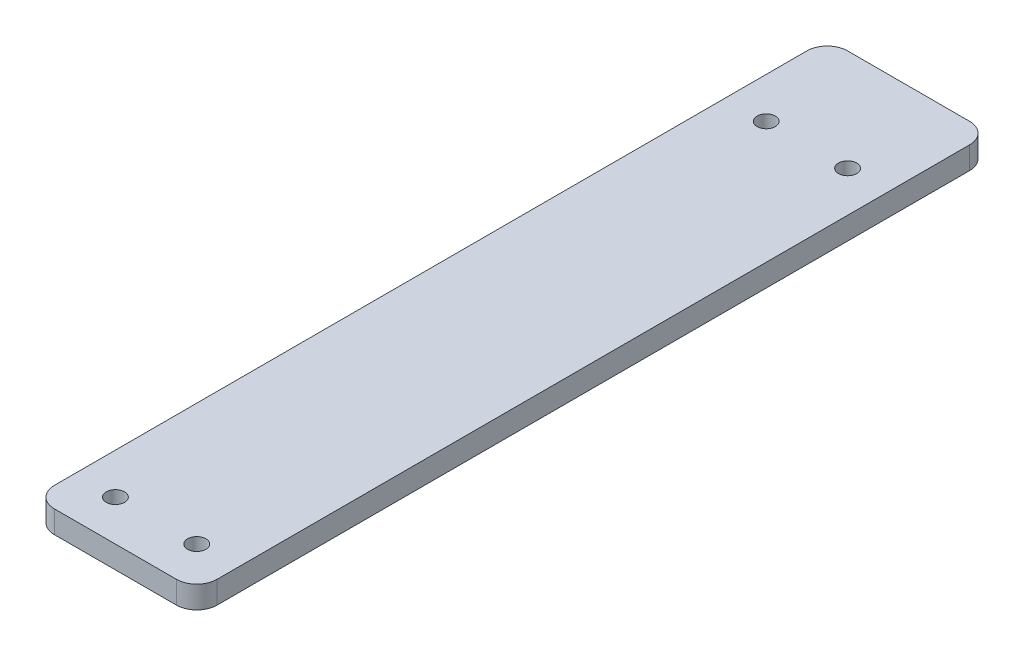
ISO-10303-21;
HEADER;
FILE_DESCRIPTION(('STEP AP214'),'2;1');
FILE_NAME('part.step','',(''),(''),'','','');
FILE_SCHEMA(('AUTOMOTIVE_DESIGN { 1 0 10303 214 1 1 1 1 }'));
ENDSEC;
DATA;
#1=APPLICATION_CONTEXT('core data for automotive mechanical design processes');
#2=APPLICATION_PROTOCOL_DEFINITION('international standard','automotive_design',2000,#1);
#3=PRODUCT_CONTEXT('',#1,'mechanical');
#4=PRODUCT('Part','Part','',(#3));
#5=PRODUCT_RELATED_PRODUCT_CATEGORY('part','',(#4));
#6=PRODUCT_DEFINITION_FORMATION('','',#4);
#7=PRODUCT_DEFINITION_CONTEXT('part definition',#1,'design');
#8=PRODUCT_DEFINITION('design','',#6,#7);
#9=PRODUCT_DEFINITION_SHAPE('','',#8);
#10=(LENGTH_UNIT() NAMED_UNIT(*) SI_UNIT(.MILLI.,.METRE.));
#11=(NAMED_UNIT(*) PLANE_ANGLE_UNIT() SI_UNIT($,.RADIAN.));
#12=(NAMED_UNIT(*) SI_UNIT($,.STERADIAN.) SOLID_ANGLE_UNIT());
#13=UNCERTAINTY_MEASURE_WITH_UNIT(LENGTH_MEASURE(1.E-05),#10,'distance_accuracy_value','');
#14=(GEOMETRIC_REPRESENTATION_CONTEXT(3) GLOBAL_UNCERTAINTY_ASSIGNED_CONTEXT((#13)) GLOBAL_UNIT_ASSIGNED_CONTEXT((#10,
#11,#12)) REPRESENTATION_CONTEXT('',''));
#15=CARTESIAN_POINT('',(0.,0.,0.));
#16=DIRECTION('',(0.,0.,1.));
#17=DIRECTION('',(1.,0.,0.));
#18=AXIS2_PLACEMENT_3D('',#15,#16,#17);
#19=CARTESIAN_POINT('',(-35.,5.5,5.));
#20=DIRECTION('',(0.,1.,0.));
#21=DIRECTION('',(0.,0.,1.));
#22=AXIS2_PLACEMENT_3D('',#19,#20,#21);
#23=PLANE('',#22);
#24=CARTESIAN_POINT('',(-30.,5.5,185.));
#25=DIRECTION('',(0.,1.,0.));
#26=DIRECTION('',(0.,0.,1.));
#27=AXIS2_PLACEMENT_3D('',#24,#25,#26);
#28=CIRCLE('',#27,2.25);
#29=CARTESIAN_POINT('',(-30.,5.5,187.25));
#30=VERTEX_POINT('',#29);
#31=EDGE_CURVE('E188',#30,#30,#28,.T.);
#32=ORIENTED_EDGE('',*,*,#31,.F.);
#33=EDGE_LOOP('',(#32));
#34=FACE_BOUND('',#33,.T.);
#35=CARTESIAN_POINT('',(-30.,5.5,25.));
#36=DIRECTION('',(0.,1.,0.));
#37=DIRECTION('',(0.,0.,1.));
#38=AXIS2_PLACEMENT_3D('',#35,#36,#37);
#39=CIRCLE('',#38,2.25);
#40=CARTESIAN_POINT('',(-30.,5.5,27.25));
#41=VERTEX_POINT('',#40);
#42=EDGE_CURVE('E134',#41,#41,#39,.T.);
#43=ORIENTED_EDGE('',*,*,#42,.F.);
#44=EDGE_LOOP('',(#43));
#45=FACE_BOUND('',#44,.T.);
#46=CARTESIAN_POINT('',(-35.,5.5,5.));
#47=DIRECTION('',(0.,1.,0.));
#48=DIRECTION('',(0.,0.,1.));
#49=AXIS2_PLACEMENT_3D('',#46,#47,#48);
#50=CIRCLE('',#49,5.);
#51=CARTESIAN_POINT('',(-35.,5.5,0.));
#52=VERTEX_POINT('',#51);
#53=CARTESIAN_POINT('',(-40.,5.5,5.));
#54=VERTEX_POINT('',#53);
#55=EDGE_CURVE('E145',#52,#54,#50,.T.);
#56=ORIENTED_EDGE('',*,*,#55,.T.);
#57=DIRECTION('',(0.,0.,1.));
#58=VECTOR('',#57,1.);
#59=CARTESIAN_POINT('',(-40.,5.5,190.));
#60=LINE('',#59,#58);
#61=CARTESIAN_POINT('',(-40.,5.5,190.));
#62=VERTEX_POINT('',#61);
#63=EDGE_CURVE('E93',#54,#62,#60,.T.);
#64=ORIENTED_EDGE('',*,*,#63,.T.);
#65=CARTESIAN_POINT('',(-35.,5.5,190.));
#66=DIRECTION('',(0.,1.,0.));
#67=DIRECTION('',(0.,0.,1.));
#68=AXIS2_PLACEMENT_3D('',#65,#66,#67);
#69=CIRCLE('',#68,5.);
#70=CARTESIAN_POINT('',(-35.,5.5,195.));
#71=VERTEX_POINT('',#70);
#72=EDGE_CURVE('E160',#62,#71,#69,.T.);
#73=ORIENTED_EDGE('',*,*,#72,.T.);
#74=DIRECTION('',(1.,0.,0.));
#75=VECTOR('',#74,1.);
#76=CARTESIAN_POINT('',(-4.99999999999996,5.5,195.));
#77=LINE('',#76,#75);
#78=CARTESIAN_POINT('',(-4.99999999999996,5.5,195.));
#79=VERTEX_POINT('',#78);
#80=EDGE_CURVE('E173',#71,#79,#77,.T.);
#81=ORIENTED_EDGE('',*,*,#80,.T.);
#82=CARTESIAN_POINT('',(-4.99999999999996,5.5,190.));
#83=DIRECTION('',(0.,1.,0.));
#84=DIRECTION('',(0.,0.,1.));
#85=AXIS2_PLACEMENT_3D('',#82,#83,#84);
#86=CIRCLE('',#85,4.99999999999999);
#87=CARTESIAN_POINT('',(0.,5.5,190.));
#88=VERTEX_POINT('',#87);
#89=EDGE_CURVE('E112',#79,#88,#86,.T.);
#90=ORIENTED_EDGE('',*,*,#89,.T.);
#91=DIRECTION('',(0.,0.,-1.));
#92=VECTOR('',#91,1.);
#93=CARTESIAN_POINT('',(0.,5.5,5.));
#94=LINE('',#93,#92);
#95=CARTESIAN_POINT('',(0.,5.5,5.));
#96=VERTEX_POINT('',#95);
#97=EDGE_CURVE('E106',#88,#96,#94,.T.);
#98=ORIENTED_EDGE('',*,*,#97,.T.);
#99=CARTESIAN_POINT('',(-4.99999999999998,5.5,5.));
#100=DIRECTION('',(0.,1.,0.));
#101=DIRECTION('',(0.,0.,1.));
#102=AXIS2_PLACEMENT_3D('',#99,#100,#101);
#103=CIRCLE('',#102,4.99999999999999);
#104=CARTESIAN_POINT('',(-4.99999999999998,5.5,0.));
#105=VERTEX_POINT('',#104);
#106=EDGE_CURVE('E110',#96,#105,#103,.T.);
#107=ORIENTED_EDGE('',*,*,#106,.T.);
#108=DIRECTION('',(-1.,0.,0.));
#109=VECTOR('',#108,1.);
#110=CARTESIAN_POINT('',(-35.,5.5,0.));
#111=LINE('',#110,#109);
#112=EDGE_CURVE('E50',#105,#52,#111,.T.);
#113=ORIENTED_EDGE('',*,*,#112,.T.);
#114=EDGE_LOOP('',(#56,#64,#73,#81,#90,#98,#107,#113));
#115=FACE_BOUND('',#114,.T.);
#116=CARTESIAN_POINT('',(-9.99999999999998,5.5,25.));
#117=DIRECTION('',(0.,1.,0.));
#118=DIRECTION('',(0.,0.,1.));
#119=AXIS2_PLACEMENT_3D('',#116,#117,#118);
#120=CIRCLE('',#119,2.25);
#121=CARTESIAN_POINT('',(-9.99999999999998,5.5,27.25));
#122=VERTEX_POINT('',#121);
#123=EDGE_CURVE('E182',#122,#122,#120,.T.);
#124=ORIENTED_EDGE('',*,*,#123,.F.);
#125=EDGE_LOOP('',(#124));
#126=FACE_BOUND('',#125,.T.);
#127=CARTESIAN_POINT('',(-9.99999999999998,5.5,185.));
#128=DIRECTION('',(0.,1.,0.));
#129=DIRECTION('',(0.,0.,1.));
#130=AXIS2_PLACEMENT_3D('',#127,#128,#129);
#131=CIRCLE('',#130,2.25);
#132=CARTESIAN_POINT('',(-9.99999999999998,5.5,187.25));
#133=VERTEX_POINT('',#132);
#134=EDGE_CURVE('E194',#133,#133,#131,.T.);
#135=ORIENTED_EDGE('',*,*,#134,.F.);
#136=EDGE_LOOP('',(#135));
#137=FACE_BOUND('',#136,.T.);
#138=ADVANCED_FACE('F33',(#34,#45,#115,#126,#137),#23,.T.);
#139=CARTESIAN_POINT('',(-35.,0.,5.));
#140=DIRECTION('',(0.,1.,0.));
#141=DIRECTION('',(0.,0.,1.));
#142=AXIS2_PLACEMENT_3D('',#139,#140,#141);
#143=PLANE('',#142);
#144=CARTESIAN_POINT('',(-35.,0.,5.));
#145=DIRECTION('',(0.,1.,0.));
#146=DIRECTION('',(0.,0.,1.));
#147=AXIS2_PLACEMENT_3D('',#144,#145,#146);
#148=CIRCLE('',#147,5.);
#149=CARTESIAN_POINT('',(-35.,0.,0.));
#150=VERTEX_POINT('',#149);
#151=CARTESIAN_POINT('',(-40.,0.,5.));
#152=VERTEX_POINT('',#151);
#153=EDGE_CURVE('E130',#150,#152,#148,.T.);
#154=ORIENTED_EDGE('',*,*,#153,.F.);
#155=DIRECTION('',(-1.,0.,0.));
#156=VECTOR('',#155,1.);
#157=CARTESIAN_POINT('',(-35.,0.,0.));
#158=LINE('',#157,#156);
#159=CARTESIAN_POINT('',(-4.99999999999998,0.,0.));
#160=VERTEX_POINT('',#159);
#161=EDGE_CURVE('E85',#160,#150,#158,.T.);
#162=ORIENTED_EDGE('',*,*,#161,.F.);
#163=CARTESIAN_POINT('',(-4.99999999999998,0.,5.));
#164=DIRECTION('',(0.,1.,0.));
#165=DIRECTION('',(0.,0.,1.));
#166=AXIS2_PLACEMENT_3D('',#163,#164,#165);
#167=CIRCLE('',#166,4.99999999999999);
#168=CARTESIAN_POINT('',(0.,0.,5.));
#169=VERTEX_POINT('',#168);
#170=EDGE_CURVE('E79',#169,#160,#167,.T.);
#171=ORIENTED_EDGE('',*,*,#170,.F.);
#172=DIRECTION('',(0.,0.,-1.));
#173=VECTOR('',#172,1.);
#174=CARTESIAN_POINT('',(0.,0.,5.));
#175=LINE('',#174,#173);
#176=CARTESIAN_POINT('',(0.,0.,190.));
#177=VERTEX_POINT('',#176);
#178=EDGE_CURVE('E120',#177,#169,#175,.T.);
#179=ORIENTED_EDGE('',*,*,#178,.F.);
#180=CARTESIAN_POINT('',(-4.99999999999996,0.,190.));
#181=DIRECTION('',(0.,1.,0.));
#182=DIRECTION('',(0.,0.,1.));
#183=AXIS2_PLACEMENT_3D('',#180,#181,#182);
#184=CIRCLE('',#183,4.99999999999999);
#185=CARTESIAN_POINT('',(-4.99999999999996,0.,195.));
#186=VERTEX_POINT('',#185);
#187=EDGE_CURVE('E140',#186,#177,#184,.T.);
#188=ORIENTED_EDGE('',*,*,#187,.F.);
#189=DIRECTION('',(1.,0.,0.));
#190=VECTOR('',#189,1.);
#191=CARTESIAN_POINT('',(-4.99999999999996,0.,195.));
#192=LINE('',#191,#190);
#193=CARTESIAN_POINT('',(-35.,0.,195.));
#194=VERTEX_POINT('',#193);
#195=EDGE_CURVE('E138',#194,#186,#192,.T.);
#196=ORIENTED_EDGE('',*,*,#195,.F.);
#197=CARTESIAN_POINT('',(-35.,0.,190.));
#198=DIRECTION('',(0.,1.,0.));
#199=DIRECTION('',(0.,0.,1.));
#200=AXIS2_PLACEMENT_3D('',#197,#198,#199);
#201=CIRCLE('',#200,5.);
#202=CARTESIAN_POINT('',(-40.,0.,190.));
#203=VERTEX_POINT('',#202);
#204=EDGE_CURVE('E136',#203,#194,#201,.T.);
#205=ORIENTED_EDGE('',*,*,#204,.F.);
#206=DIRECTION('',(0.,0.,1.));
#207=VECTOR('',#206,1.);
#208=CARTESIAN_POINT('',(-40.,0.,190.));
#209=LINE('',#208,#207);
#210=EDGE_CURVE('E133',#152,#203,#209,.T.);
#211=ORIENTED_EDGE('',*,*,#210,.F.);
#212=EDGE_LOOP('',(#154,#162,#171,#179,#188,#196,#205,#211));
#213=FACE_BOUND('',#212,.T.);
#214=CARTESIAN_POINT('',(-30.,0.,25.));
#215=DIRECTION('',(0.,1.,0.));
#216=DIRECTION('',(0.,0.,1.));
#217=AXIS2_PLACEMENT_3D('',#214,#215,#216);
#218=CIRCLE('',#217,2.25);
#219=CARTESIAN_POINT('',(-30.,0.,27.25));
#220=VERTEX_POINT('',#219);
#221=EDGE_CURVE('E179',#220,#220,#218,.T.);
#222=ORIENTED_EDGE('',*,*,#221,.T.);
#223=EDGE_LOOP('',(#222));
#224=FACE_BOUND('',#223,.T.);
#225=CARTESIAN_POINT('',(-9.99999999999998,0.,25.));
#226=DIRECTION('',(0.,1.,0.));
#227=DIRECTION('',(0.,0.,1.));
#228=AXIS2_PLACEMENT_3D('',#225,#226,#227);
#229=CIRCLE('',#228,2.25);
#230=CARTESIAN_POINT('',(-9.99999999999998,0.,27.25));
#231=VERTEX_POINT('',#230);
#232=EDGE_CURVE('E185',#231,#231,#229,.T.);
#233=ORIENTED_EDGE('',*,*,#232,.T.);
#234=EDGE_LOOP('',(#233));
#235=FACE_BOUND('',#234,.T.);
#236=CARTESIAN_POINT('',(-30.,0.,185.));
#237=DIRECTION('',(0.,1.,0.));
#238=DIRECTION('',(0.,0.,1.));
#239=AXIS2_PLACEMENT_3D('',#236,#237,#238);
#240=CIRCLE('',#239,2.25);
#241=CARTESIAN_POINT('',(-30.,0.,187.25));
#242=VERTEX_POINT('',#241);
#243=EDGE_CURVE('E191',#242,#242,#240,.T.);
#244=ORIENTED_EDGE('',*,*,#243,.T.);
#245=EDGE_LOOP('',(#244));
#246=FACE_BOUND('',#245,.T.);
#247=CARTESIAN_POINT('',(-9.99999999999998,0.,185.));
#248=DIRECTION('',(0.,1.,0.));
#249=DIRECTION('',(0.,0.,1.));
#250=AXIS2_PLACEMENT_3D('',#247,#248,#249);
#251=CIRCLE('',#250,2.25);
#252=CARTESIAN_POINT('',(-9.99999999999998,0.,187.25));
#253=VERTEX_POINT('',#252);
#254=EDGE_CURVE('E197',#253,#253,#251,.T.);
#255=ORIENTED_EDGE('',*,*,#254,.T.);
#256=EDGE_LOOP('',(#255));
#257=FACE_BOUND('',#256,.T.);
#258=ADVANCED_FACE('F164',(#213,#224,#235,#246,#257),#143,.F.);
#259=CARTESIAN_POINT('',(-35.,5.5,5.));
#260=DIRECTION('',(0.,-1.,0.));
#261=DIRECTION('',(0.,0.,-1.));
#262=AXIS2_PLACEMENT_3D('',#259,#260,#261);
#263=CYLINDRICAL_SURFACE('',#262,5.);
#264=ORIENTED_EDGE('',*,*,#153,.T.);
#265=DIRECTION('',(0.,-1.,0.));
#266=VECTOR('',#265,1.);
#267=CARTESIAN_POINT('',(-40.,5.5,5.));
#268=LINE('',#267,#266);
#269=EDGE_CURVE('E11',#54,#152,#268,.T.);
#270=ORIENTED_EDGE('',*,*,#269,.F.);
#271=ORIENTED_EDGE('',*,*,#55,.F.);
#272=DIRECTION('',(0.,-1.,0.));
#273=VECTOR('',#272,1.);
#274=CARTESIAN_POINT('',(-35.,5.5,0.));
#275=LINE('',#274,#273);
#276=EDGE_CURVE('E126',#52,#150,#275,.T.);
#277=ORIENTED_EDGE('',*,*,#276,.T.);
#278=EDGE_LOOP('',(#264,#270,#271,#277));
#279=FACE_BOUND('',#278,.T.);
#280=ADVANCED_FACE('F35',(#279),#263,.T.);
#281=CARTESIAN_POINT('',(-40.,5.5,190.));
#282=DIRECTION('',(1.,0.,0.));
#283=DIRECTION('',(0.,0.,-1.));
#284=AXIS2_PLACEMENT_3D('',#281,#282,#283);
#285=PLANE('',#284);
#286=ORIENTED_EDGE('',*,*,#210,.T.);
#287=DIRECTION('',(0.,-1.,0.));
#288=VECTOR('',#287,1.);
#289=CARTESIAN_POINT('',(-40.,5.5,190.));
#290=LINE('',#289,#288);
#291=EDGE_CURVE('E42',#62,#203,#290,.T.);
#292=ORIENTED_EDGE('',*,*,#291,.F.);
#293=ORIENTED_EDGE('',*,*,#63,.F.);
#294=ORIENTED_EDGE('',*,*,#269,.T.);
#295=EDGE_LOOP('',(#286,#292,#293,#294));
#296=FACE_BOUND('',#295,.T.);
#297=ADVANCED_FACE('F231',(#296),#285,.F.);
#298=CARTESIAN_POINT('',(-35.,5.5,190.));
#299=DIRECTION('',(0.,-1.,0.));
#300=DIRECTION('',(0.,0.,-1.));
#301=AXIS2_PLACEMENT_3D('',#298,#299,#300);
#302=CYLINDRICAL_SURFACE('',#301,5.);
#303=ORIENTED_EDGE('',*,*,#204,.T.);
#304=DIRECTION('',(0.,-1.,0.));
#305=VECTOR('',#304,1.);
#306=CARTESIAN_POINT('',(-35.,5.5,195.));
#307=LINE('',#306,#305);
#308=EDGE_CURVE('E152',#71,#194,#307,.T.);
#309=ORIENTED_EDGE('',*,*,#308,.F.);
#310=ORIENTED_EDGE('',*,*,#72,.F.);
#311=ORIENTED_EDGE('',*,*,#291,.T.);
#312=EDGE_LOOP('',(#303,#309,#310,#311));
#313=FACE_BOUND('',#312,.T.);
#314=ADVANCED_FACE('F158',(#313),#302,.T.);
#315=CARTESIAN_POINT('',(-4.99999999999996,5.5,195.));
#316=DIRECTION('',(0.,0.,-1.));
#317=DIRECTION('',(-1.,0.,0.));
#318=AXIS2_PLACEMENT_3D('',#315,#316,#317);
#319=PLANE('',#318);
#320=ORIENTED_EDGE('',*,*,#195,.T.);
#321=DIRECTION('',(0.,-1.,0.));
#322=VECTOR('',#321,1.);
#323=CARTESIAN_POINT('',(-4.99999999999996,5.5,195.));
#324=LINE('',#323,#322);
#325=EDGE_CURVE('E149',#79,#186,#324,.T.);
#326=ORIENTED_EDGE('',*,*,#325,.F.);
#327=ORIENTED_EDGE('',*,*,#80,.F.);
#328=ORIENTED_EDGE('',*,*,#308,.T.);
#329=EDGE_LOOP('',(#320,#326,#327,#328));
#330=FACE_BOUND('',#329,.T.);
#331=ADVANCED_FACE('F169',(#330),#319,.F.);
#332=CARTESIAN_POINT('',(-4.99999999999996,5.5,190.));
#333=DIRECTION('',(0.,-1.,0.));
#334=DIRECTION('',(0.,0.,-1.));
#335=AXIS2_PLACEMENT_3D('',#332,#333,#334);
#336=CYLINDRICAL_SURFACE('',#335,4.99999999999999);
#337=ORIENTED_EDGE('',*,*,#187,.T.);
#338=DIRECTION('',(0.,-1.,0.));
#339=VECTOR('',#338,1.);
#340=CARTESIAN_POINT('',(0.,5.5,190.));
#341=LINE('',#340,#339);
#342=EDGE_CURVE('E121',#88,#177,#341,.T.);
#343=ORIENTED_EDGE('',*,*,#342,.F.);
#344=ORIENTED_EDGE('',*,*,#89,.F.);
#345=ORIENTED_EDGE('',*,*,#325,.T.);
#346=EDGE_LOOP('',(#337,#343,#344,#345));
#347=FACE_BOUND('',#346,.T.);
#348=ADVANCED_FACE('F172',(#347),#336,.T.);
#349=CARTESIAN_POINT('',(0.,5.5,5.));
#350=DIRECTION('',(-1.,0.,0.));
#351=DIRECTION('',(0.,0.,1.));
#352=AXIS2_PLACEMENT_3D('',#349,#350,#351);
#353=PLANE('',#352);
#354=ORIENTED_EDGE('',*,*,#178,.T.);
#355=DIRECTION('',(0.,-1.,0.));
#356=VECTOR('',#355,1.);
#357=CARTESIAN_POINT('',(0.,5.5,5.));
#358=LINE('',#357,#356);
#359=EDGE_CURVE('E117',#96,#169,#358,.T.);
#360=ORIENTED_EDGE('',*,*,#359,.F.);
#361=ORIENTED_EDGE('',*,*,#97,.F.);
#362=ORIENTED_EDGE('',*,*,#342,.T.);
#363=EDGE_LOOP('',(#354,#360,#361,#362));
#364=FACE_BOUND('',#363,.T.);
#365=ADVANCED_FACE('F118',(#364),#353,.F.);
#366=CARTESIAN_POINT('',(-4.99999999999998,5.5,5.));
#367=DIRECTION('',(0.,-1.,0.));
#368=DIRECTION('',(0.,0.,-1.));
#369=AXIS2_PLACEMENT_3D('',#366,#367,#368);
#370=CYLINDRICAL_SURFACE('',#369,4.99999999999999);
#371=ORIENTED_EDGE('',*,*,#170,.T.);
#372=DIRECTION('',(0.,-1.,0.));
#373=VECTOR('',#372,1.);
#374=CARTESIAN_POINT('',(-4.99999999999998,5.5,0.));
#375=LINE('',#374,#373);
#376=EDGE_CURVE('E122',#105,#160,#375,.T.);
#377=ORIENTED_EDGE('',*,*,#376,.F.);
#378=ORIENTED_EDGE('',*,*,#106,.F.);
#379=ORIENTED_EDGE('',*,*,#359,.T.);
#380=EDGE_LOOP('',(#371,#377,#378,#379));
#381=FACE_BOUND('',#380,.T.);
#382=ADVANCED_FACE('F124',(#381),#370,.T.);
#383=CARTESIAN_POINT('',(-35.,5.5,0.));
#384=DIRECTION('',(0.,0.,1.));
#385=DIRECTION('',(1.,0.,0.));
#386=AXIS2_PLACEMENT_3D('',#383,#384,#385);
#387=PLANE('',#386);
#388=ORIENTED_EDGE('',*,*,#161,.T.);
#389=ORIENTED_EDGE('',*,*,#276,.F.);
#390=ORIENTED_EDGE('',*,*,#112,.F.);
#391=ORIENTED_EDGE('',*,*,#376,.T.);
#392=EDGE_LOOP('',(#388,#389,#390,#391));
#393=FACE_BOUND('',#392,.T.);
#394=ADVANCED_FACE('F219',(#393),#387,.F.);
#395=CARTESIAN_POINT('',(-30.,5.5,25.));
#396=DIRECTION('',(0.,-1.,0.));
#397=DIRECTION('',(0.,0.,-1.));
#398=AXIS2_PLACEMENT_3D('',#395,#396,#397);
#399=CYLINDRICAL_SURFACE('',#398,2.25);
#400=ORIENTED_EDGE('',*,*,#42,.T.);
#401=EDGE_LOOP('',(#400));
#402=FACE_BOUND('',#401,.T.);
#403=ORIENTED_EDGE('',*,*,#221,.F.);
#404=EDGE_LOOP('',(#403));
#405=FACE_BOUND('',#404,.T.);
#406=ADVANCED_FACE('F216',(#402,#405),#399,.F.);
#407=CARTESIAN_POINT('',(-9.99999999999998,5.5,25.));
#408=DIRECTION('',(0.,-1.,0.));
#409=DIRECTION('',(0.,0.,-1.));
#410=AXIS2_PLACEMENT_3D('',#407,#408,#409);
#411=CYLINDRICAL_SURFACE('',#410,2.25);
#412=ORIENTED_EDGE('',*,*,#123,.T.);
#413=EDGE_LOOP('',(#412));
#414=FACE_BOUND('',#413,.T.);
#415=ORIENTED_EDGE('',*,*,#232,.F.);
#416=EDGE_LOOP('',(#415));
#417=FACE_BOUND('',#416,.T.);
#418=ADVANCED_FACE('F295',(#414,#417),#411,.F.);
#419=CARTESIAN_POINT('',(-30.,5.5,185.));
#420=DIRECTION('',(0.,-1.,0.));
#421=DIRECTION('',(0.,0.,-1.));
#422=AXIS2_PLACEMENT_3D('',#419,#420,#421);
#423=CYLINDRICAL_SURFACE('',#422,2.25);
#424=ORIENTED_EDGE('',*,*,#31,.T.);
#425=EDGE_LOOP('',(#424));
#426=FACE_BOUND('',#425,.T.);
#427=ORIENTED_EDGE('',*,*,#243,.F.);
#428=EDGE_LOOP('',(#427));
#429=FACE_BOUND('',#428,.T.);
#430=ADVANCED_FACE('F303',(#426,#429),#423,.F.);
#431=CARTESIAN_POINT('',(-9.99999999999998,5.5,185.));
#432=DIRECTION('',(0.,-1.,0.));
#433=DIRECTION('',(0.,0.,-1.));
#434=AXIS2_PLACEMENT_3D('',#431,#432,#433);
#435=CYLINDRICAL_SURFACE('',#434,2.25);
#436=ORIENTED_EDGE('',*,*,#134,.T.);
#437=EDGE_LOOP('',(#436));
#438=FACE_BOUND('',#437,.T.);
#439=ORIENTED_EDGE('',*,*,#254,.F.);
#440=EDGE_LOOP('',(#439));
#441=FACE_BOUND('',#440,.T.);
#442=ADVANCED_FACE('F203',(#438,#441),#435,.F.);
#443=CLOSED_SHELL('',(#138,#258,#280,#297,#314,#331,#348,#365,#382,#394,#406,#418,#430,#442));
#444=MANIFOLD_SOLID_BREP('B2',#443);
#445=ADVANCED_BREP_SHAPE_REPRESENTATION('',(#18,#444),#14);
#446=SHAPE_DEFINITION_REPRESENTATION(#9,#445);
ENDSEC;
END-ISO-10303-21;
